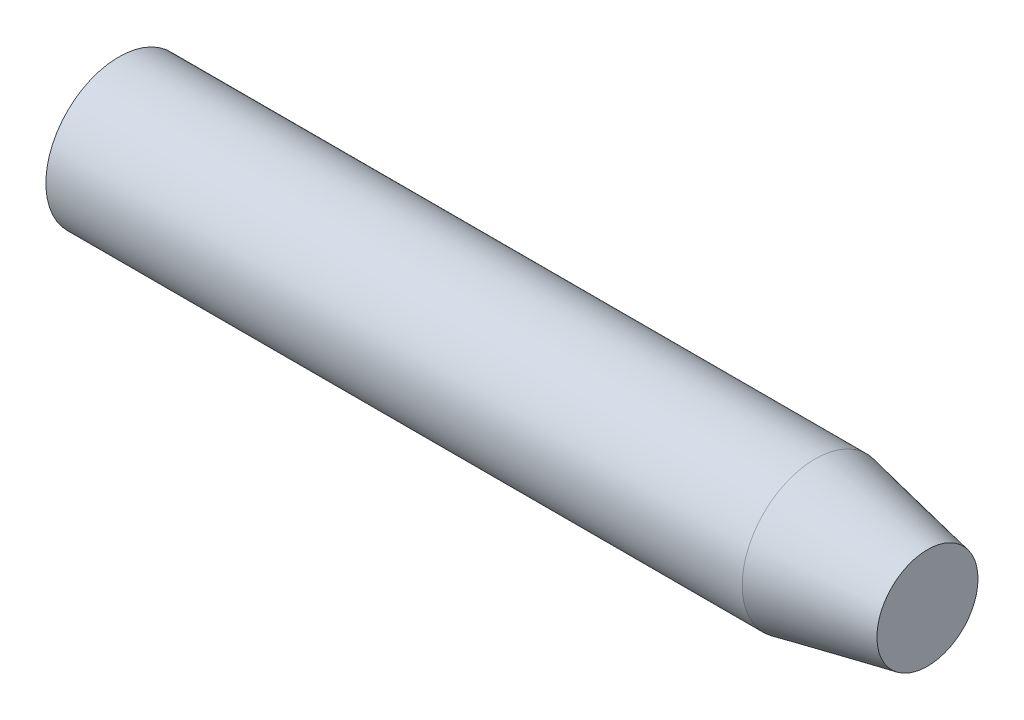
ISO-10303-21;
HEADER;
FILE_DESCRIPTION(('STEP AP214'),'2;1');
FILE_NAME('part.step','',(''),(''),'','','');
FILE_SCHEMA(('AUTOMOTIVE_DESIGN { 1 0 10303 214 1 1 1 1 }'));
ENDSEC;
DATA;
#1=APPLICATION_CONTEXT('core data for automotive mechanical design processes');
#2=APPLICATION_PROTOCOL_DEFINITION('international standard','automotive_design',2000,#1);
#3=PRODUCT_CONTEXT('',#1,'mechanical');
#4=PRODUCT('Part','Part','',(#3));
#5=PRODUCT_RELATED_PRODUCT_CATEGORY('part','',(#4));
#6=PRODUCT_DEFINITION_FORMATION('','',#4);
#7=PRODUCT_DEFINITION_CONTEXT('part definition',#1,'design');
#8=PRODUCT_DEFINITION('design','',#6,#7);
#9=PRODUCT_DEFINITION_SHAPE('','',#8);
#10=(LENGTH_UNIT() NAMED_UNIT(*) SI_UNIT(.MILLI.,.METRE.));
#11=(NAMED_UNIT(*) PLANE_ANGLE_UNIT() SI_UNIT($,.RADIAN.));
#12=(NAMED_UNIT(*) SI_UNIT($,.STERADIAN.) SOLID_ANGLE_UNIT());
#13=UNCERTAINTY_MEASURE_WITH_UNIT(LENGTH_MEASURE(1.E-05),#10,'distance_accuracy_value','');
#14=(GEOMETRIC_REPRESENTATION_CONTEXT(3) GLOBAL_UNCERTAINTY_ASSIGNED_CONTEXT((#13)) GLOBAL_UNIT_ASSIGNED_CONTEXT((#10,
#11,#12)) REPRESENTATION_CONTEXT('',''));
#15=CARTESIAN_POINT('',(0.,0.,0.));
#16=DIRECTION('',(0.,0.,1.));
#17=DIRECTION('',(1.,0.,0.));
#18=AXIS2_PLACEMENT_3D('',#15,#16,#17);
#19=CARTESIAN_POINT('',(-36.,6.49999999999999,0.));
#20=DIRECTION('',(-1.,0.,0.));
#21=DIRECTION('',(0.,0.,1.));
#22=AXIS2_PLACEMENT_3D('',#19,#20,#21);
#23=PLANE('',#22);
#24=CARTESIAN_POINT('',(-36.,0.,0.));
#25=DIRECTION('',(1.,0.,0.));
#26=DIRECTION('',(0.,0.,-1.));
#27=AXIS2_PLACEMENT_3D('',#24,#25,#26);
#28=CIRCLE('',#27,4.);
#29=CARTESIAN_POINT('',(-36.,0.,-4.));
#30=VERTEX_POINT('',#29);
#31=EDGE_CURVE('E10',#30,#30,#28,.T.);
#32=ORIENTED_EDGE('',*,*,#31,.T.);
#33=EDGE_LOOP('',(#32));
#34=FACE_BOUND('',#33,.T.);
#35=CARTESIAN_POINT('',(-36.,0.,0.));
#36=DIRECTION('',(1.,0.,0.));
#37=DIRECTION('',(0.,0.,-1.));
#38=AXIS2_PLACEMENT_3D('',#35,#36,#37);
#39=CIRCLE('',#38,6.5);
#40=CARTESIAN_POINT('',(-36.,0.,-6.5));
#41=VERTEX_POINT('',#40);
#42=EDGE_CURVE('E51',#41,#41,#39,.T.);
#43=ORIENTED_EDGE('',*,*,#42,.F.);
#44=EDGE_LOOP('',(#43));
#45=FACE_BOUND('',#44,.T.);
#46=ADVANCED_FACE('F32',(#34,#45),#23,.T.);
#47=CARTESIAN_POINT('',(36.,0.,0.));
#48=DIRECTION('',(1.,0.,0.));
#49=DIRECTION('',(0.,0.,-1.));
#50=AXIS2_PLACEMENT_3D('',#47,#48,#49);
#51=CYLINDRICAL_SURFACE('',#50,4.);
#52=CARTESIAN_POINT('',(26.,0.,0.));
#53=DIRECTION('',(1.,0.,0.));
#54=DIRECTION('',(0.,0.,-1.));
#55=AXIS2_PLACEMENT_3D('',#52,#53,#54);
#56=CIRCLE('',#55,4.);
#57=CARTESIAN_POINT('',(26.,0.,-4.));
#58=VERTEX_POINT('',#57);
#59=EDGE_CURVE('E38',#58,#58,#56,.T.);
#60=ORIENTED_EDGE('',*,*,#59,.T.);
#61=EDGE_LOOP('',(#60));
#62=FACE_BOUND('',#61,.T.);
#63=ORIENTED_EDGE('',*,*,#31,.F.);
#64=EDGE_LOOP('',(#63));
#65=FACE_BOUND('',#64,.T.);
#66=ADVANCED_FACE('F59',(#62,#65),#51,.F.);
#67=CARTESIAN_POINT('',(26.,3.99999999999999,0.));
#68=DIRECTION('',(-1.,0.,0.));
#69=DIRECTION('',(0.,0.,1.));
#70=AXIS2_PLACEMENT_3D('',#67,#68,#69);
#71=PLANE('',#70);
#72=ORIENTED_EDGE('',*,*,#59,.F.);
#73=EDGE_LOOP('',(#72));
#74=FACE_BOUND('',#73,.T.);
#75=ADVANCED_FACE('F63',(#74),#71,.T.);
#76=CARTESIAN_POINT('',(36.,4.5,0.));
#77=DIRECTION('',(1.,0.,0.));
#78=DIRECTION('',(0.,0.,-1.));
#79=AXIS2_PLACEMENT_3D('',#76,#77,#78);
#80=PLANE('',#79);
#81=CARTESIAN_POINT('',(36.,0.,0.));
#82=DIRECTION('',(1.,0.,0.));
#83=DIRECTION('',(0.,0.,-1.));
#84=AXIS2_PLACEMENT_3D('',#81,#82,#83);
#85=CIRCLE('',#84,4.50000000000001);
#86=CARTESIAN_POINT('',(36.,0.,-4.50000000000001));
#87=VERTEX_POINT('',#86);
#88=EDGE_CURVE('E42',#87,#87,#85,.T.);
#89=ORIENTED_EDGE('',*,*,#88,.T.);
#90=EDGE_LOOP('',(#89));
#91=FACE_BOUND('',#90,.T.);
#92=ADVANCED_FACE('F67',(#91),#80,.T.);
#93=CARTESIAN_POINT('',(36.,0.,0.));
#94=DIRECTION('',(-1.,0.,0.));
#95=DIRECTION('',(0.,0.,1.));
#96=AXIS2_PLACEMENT_3D('',#93,#94,#95);
#97=CONICAL_SURFACE('',#96,4.50000000000001,0.19739555984988);
#98=CARTESIAN_POINT('',(26.,0.,0.));
#99=DIRECTION('',(1.,0.,0.));
#100=DIRECTION('',(0.,0.,-1.));
#101=AXIS2_PLACEMENT_3D('',#98,#99,#100);
#102=CIRCLE('',#101,6.5);
#103=CARTESIAN_POINT('',(26.,0.,-6.5));
#104=VERTEX_POINT('',#103);
#105=EDGE_CURVE('E46',#104,#104,#102,.T.);
#106=ORIENTED_EDGE('',*,*,#105,.T.);
#107=EDGE_LOOP('',(#106));
#108=FACE_BOUND('',#107,.T.);
#109=ORIENTED_EDGE('',*,*,#88,.F.);
#110=EDGE_LOOP('',(#109));
#111=FACE_BOUND('',#110,.T.);
#112=ADVANCED_FACE('F74',(#108,#111),#97,.T.);
#113=CARTESIAN_POINT('',(36.,0.,0.));
#114=DIRECTION('',(1.,0.,0.));
#115=DIRECTION('',(0.,0.,-1.));
#116=AXIS2_PLACEMENT_3D('',#113,#114,#115);
#117=CYLINDRICAL_SURFACE('',#116,6.5);
#118=ORIENTED_EDGE('',*,*,#42,.T.);
#119=EDGE_LOOP('',(#118));
#120=FACE_BOUND('',#119,.T.);
#121=ORIENTED_EDGE('',*,*,#105,.F.);
#122=EDGE_LOOP('',(#121));
#123=FACE_BOUND('',#122,.T.);
#124=ADVANCED_FACE('F55',(#120,#123),#117,.T.);
#125=CLOSED_SHELL('',(#46,#66,#75,#92,#112,#124));
#126=MANIFOLD_SOLID_BREP('B2',#125);
#127=ADVANCED_BREP_SHAPE_REPRESENTATION('',(#18,#126),#14);
#128=SHAPE_DEFINITION_REPRESENTATION(#9,#127);
ENDSEC;
END-ISO-10303-21;
